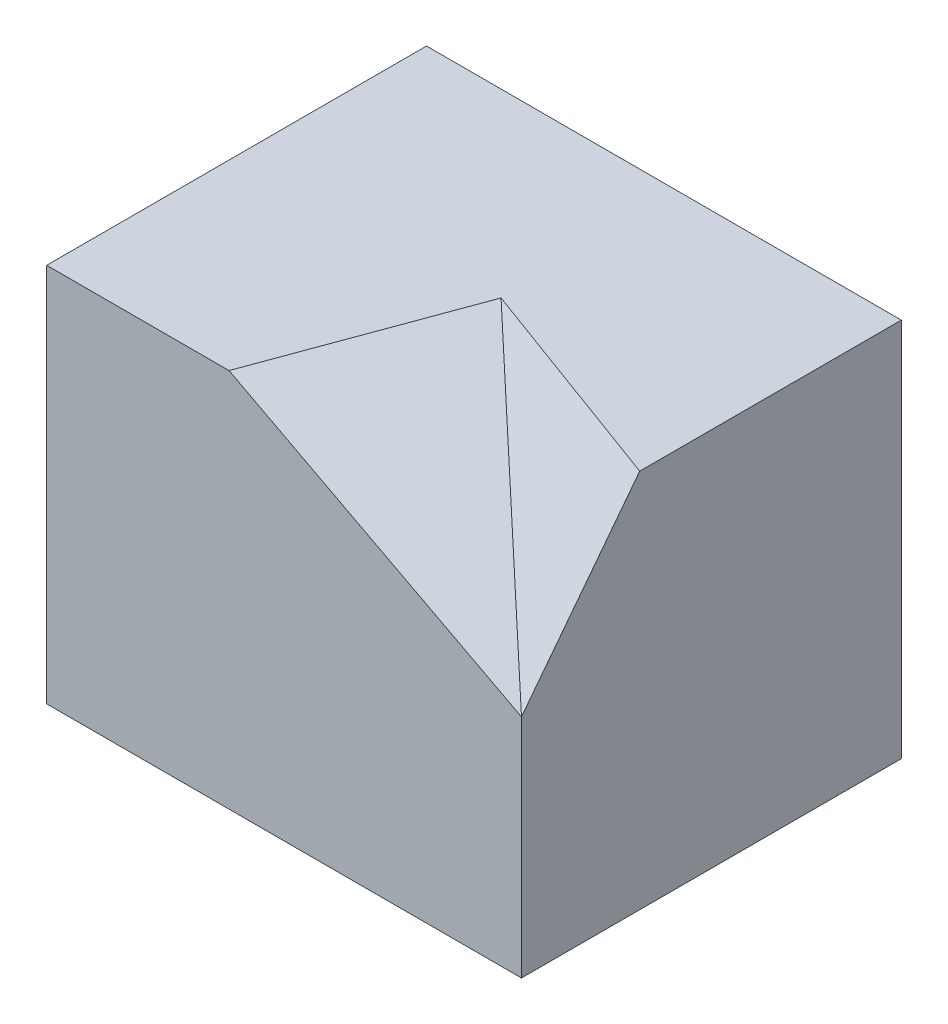
ISO-10303-21;
HEADER;
FILE_DESCRIPTION(('STEP AP214'),'2;1');
FILE_NAME('part.step','',(''),(''),'','','');
FILE_SCHEMA(('AUTOMOTIVE_DESIGN { 1 0 10303 214 1 1 1 1 }'));
ENDSEC;
DATA;
#1=APPLICATION_CONTEXT('core data for automotive mechanical design processes');
#2=APPLICATION_PROTOCOL_DEFINITION('international standard','automotive_design',2000,#1);
#3=PRODUCT_CONTEXT('',#1,'mechanical');
#4=PRODUCT('Part','Part','',(#3));
#5=PRODUCT_RELATED_PRODUCT_CATEGORY('part','',(#4));
#6=PRODUCT_DEFINITION_FORMATION('','',#4);
#7=PRODUCT_DEFINITION_CONTEXT('part definition',#1,'design');
#8=PRODUCT_DEFINITION('design','',#6,#7);
#9=PRODUCT_DEFINITION_SHAPE('','',#8);
#10=(LENGTH_UNIT() NAMED_UNIT(*) SI_UNIT(.MILLI.,.METRE.));
#11=(NAMED_UNIT(*) PLANE_ANGLE_UNIT() SI_UNIT($,.RADIAN.));
#12=(NAMED_UNIT(*) SI_UNIT($,.STERADIAN.) SOLID_ANGLE_UNIT());
#13=UNCERTAINTY_MEASURE_WITH_UNIT(LENGTH_MEASURE(1.E-05),#10,'distance_accuracy_value','');
#14=(GEOMETRIC_REPRESENTATION_CONTEXT(3) GLOBAL_UNCERTAINTY_ASSIGNED_CONTEXT((#13)) GLOBAL_UNIT_ASSIGNED_CONTEXT((#10,
#11,#12)) REPRESENTATION_CONTEXT('',''));
#15=CARTESIAN_POINT('',(0.,0.,0.));
#16=DIRECTION('',(0.,0.,1.));
#17=DIRECTION('',(1.,0.,0.));
#18=AXIS2_PLACEMENT_3D('',#15,#16,#17);
#19=CARTESIAN_POINT('',(0.,1016.,0.));
#20=DIRECTION('',(0.,0.,-1.));
#21=DIRECTION('',(-1.,0.,0.));
#22=AXIS2_PLACEMENT_3D('',#19,#20,#21);
#23=PLANE('',#22);
#24=DIRECTION('',(0.885288524707025,-0.465042178755926,0.));
#25=VECTOR('',#24,1.);
#26=CARTESIAN_POINT('',(487.697722315545,1016.,0.));
#27=LINE('',#26,#25);
#28=CARTESIAN_POINT('',(487.697722315545,1016.,0.));
#29=VERTEX_POINT('',#28);
#30=CARTESIAN_POINT('',(1270.,605.056510384003,0.));
#31=VERTEX_POINT('',#30);
#32=EDGE_CURVE('E105',#29,#31,#27,.T.);
#33=ORIENTED_EDGE('',*,*,#32,.F.);
#34=DIRECTION('',(1.,0.,0.));
#35=VECTOR('',#34,1.);
#36=CARTESIAN_POINT('',(0.,1016.,0.));
#37=LINE('',#36,#35);
#38=CARTESIAN_POINT('',(0.,1016.,0.));
#39=VERTEX_POINT('',#38);
#40=EDGE_CURVE('E92',#39,#29,#37,.T.);
#41=ORIENTED_EDGE('',*,*,#40,.F.);
#42=DIRECTION('',(0.,-1.,0.));
#43=VECTOR('',#42,1.);
#44=CARTESIAN_POINT('',(0.,1016.,0.));
#45=LINE('',#44,#43);
#46=CARTESIAN_POINT('',(0.,0.,0.));
#47=VERTEX_POINT('',#46);
#48=EDGE_CURVE('E12',#39,#47,#45,.T.);
#49=ORIENTED_EDGE('',*,*,#48,.T.);
#50=DIRECTION('',(1.,0.,0.));
#51=VECTOR('',#50,1.);
#52=CARTESIAN_POINT('',(0.,0.,0.));
#53=LINE('',#52,#51);
#54=CARTESIAN_POINT('',(1270.,0.,0.));
#55=VERTEX_POINT('',#54);
#56=EDGE_CURVE('E133',#47,#55,#53,.T.);
#57=ORIENTED_EDGE('',*,*,#56,.T.);
#58=DIRECTION('',(0.,-1.,0.));
#59=VECTOR('',#58,1.);
#60=CARTESIAN_POINT('',(1270.,1016.,0.));
#61=LINE('',#60,#59);
#62=EDGE_CURVE('E49',#31,#55,#61,.T.);
#63=ORIENTED_EDGE('',*,*,#62,.F.);
#64=EDGE_LOOP('',(#33,#41,#49,#57,#63));
#65=FACE_BOUND('',#64,.T.);
#66=ADVANCED_FACE('F39',(#65),#23,.F.);
#67=CARTESIAN_POINT('',(0.,1016.,0.));
#68=DIRECTION('',(0.,-1.,0.));
#69=DIRECTION('',(0.,0.,-1.));
#70=AXIS2_PLACEMENT_3D('',#67,#68,#69);
#71=PLANE('',#70);
#72=DIRECTION('',(-0.938549534107963,0.,-0.345144566849496));
#73=VECTOR('',#72,1.);
#74=CARTESIAN_POINT('',(683.341932375015,1016.,-532.014117673498));
#75=LINE('',#74,#73);
#76=CARTESIAN_POINT('',(1270.,1016.,-316.275003987149));
#77=VERTEX_POINT('',#76);
#78=CARTESIAN_POINT('',(683.341932375015,1016.,-532.014117673498));
#79=VERTEX_POINT('',#78);
#80=EDGE_CURVE('E43',#77,#79,#75,.T.);
#81=ORIENTED_EDGE('',*,*,#80,.F.);
#82=DIRECTION('',(0.,0.,-1.));
#83=VECTOR('',#82,1.);
#84=CARTESIAN_POINT('',(1270.,1016.,0.));
#85=LINE('',#84,#83);
#86=CARTESIAN_POINT('',(1270.,1016.,-1016.));
#87=VERTEX_POINT('',#86);
#88=EDGE_CURVE('E119',#77,#87,#85,.T.);
#89=ORIENTED_EDGE('',*,*,#88,.T.);
#90=DIRECTION('',(-1.,0.,0.));
#91=VECTOR('',#90,1.);
#92=CARTESIAN_POINT('',(0.,1016.,-1016.));
#93=LINE('',#92,#91);
#94=CARTESIAN_POINT('',(0.,1016.,-1016.));
#95=VERTEX_POINT('',#94);
#96=EDGE_CURVE('E66',#87,#95,#93,.T.);
#97=ORIENTED_EDGE('',*,*,#96,.T.);
#98=DIRECTION('',(0.,0.,1.));
#99=VECTOR('',#98,1.);
#100=CARTESIAN_POINT('',(0.,1016.,0.));
#101=LINE('',#100,#99);
#102=EDGE_CURVE('E117',#95,#39,#101,.T.);
#103=ORIENTED_EDGE('',*,*,#102,.T.);
#104=ORIENTED_EDGE('',*,*,#40,.T.);
#105=DIRECTION('',(-0.345144566849496,0.,0.938549534107963));
#106=VECTOR('',#105,1.);
#107=CARTESIAN_POINT('',(487.697722315545,1016.,0.));
#108=LINE('',#107,#106);
#109=EDGE_CURVE('E102',#79,#29,#108,.T.);
#110=ORIENTED_EDGE('',*,*,#109,.F.);
#111=EDGE_LOOP('',(#81,#89,#97,#103,#104,#110));
#112=FACE_BOUND('',#111,.T.);
#113=ADVANCED_FACE('F115',(#112),#71,.F.);
#114=CARTESIAN_POINT('',(0.,1016.,0.));
#115=DIRECTION('',(1.,0.,0.));
#116=DIRECTION('',(0.,0.,-1.));
#117=AXIS2_PLACEMENT_3D('',#114,#115,#116);
#118=PLANE('',#117);
#119=DIRECTION('',(0.,0.,1.));
#120=VECTOR('',#119,1.);
#121=CARTESIAN_POINT('',(0.,0.,0.));
#122=LINE('',#121,#120);
#123=CARTESIAN_POINT('',(0.,0.,-1016.));
#124=VERTEX_POINT('',#123);
#125=EDGE_CURVE('E113',#124,#47,#122,.T.);
#126=ORIENTED_EDGE('',*,*,#125,.T.);
#127=ORIENTED_EDGE('',*,*,#48,.F.);
#128=ORIENTED_EDGE('',*,*,#102,.F.);
#129=DIRECTION('',(0.,-1.,0.));
#130=VECTOR('',#129,1.);
#131=CARTESIAN_POINT('',(0.,1016.,-1016.));
#132=LINE('',#131,#130);
#133=EDGE_CURVE('E130',#95,#124,#132,.T.);
#134=ORIENTED_EDGE('',*,*,#133,.T.);
#135=EDGE_LOOP('',(#126,#127,#128,#134));
#136=FACE_BOUND('',#135,.T.);
#137=ADVANCED_FACE('F41',(#136),#118,.F.);
#138=CARTESIAN_POINT('',(1270.,1016.,0.));
#139=DIRECTION('',(-1.,0.,0.));
#140=DIRECTION('',(0.,0.,1.));
#141=AXIS2_PLACEMENT_3D('',#138,#139,#140);
#142=PLANE('',#141);
#143=ORIENTED_EDGE('',*,*,#88,.F.);
#144=DIRECTION('',(0.,-0.792470539725738,0.609910193116));
#145=VECTOR('',#144,1.);
#146=CARTESIAN_POINT('',(1270.,1016.,-316.275003987149));
#147=LINE('',#146,#145);
#148=EDGE_CURVE('E109',#77,#31,#147,.T.);
#149=ORIENTED_EDGE('',*,*,#148,.T.);
#150=ORIENTED_EDGE('',*,*,#62,.T.);
#151=DIRECTION('',(0.,0.,-1.));
#152=VECTOR('',#151,1.);
#153=CARTESIAN_POINT('',(1270.,0.,0.));
#154=LINE('',#153,#152);
#155=CARTESIAN_POINT('',(1270.,0.,-1016.));
#156=VERTEX_POINT('',#155);
#157=EDGE_CURVE('E135',#55,#156,#154,.T.);
#158=ORIENTED_EDGE('',*,*,#157,.T.);
#159=DIRECTION('',(0.,-1.,0.));
#160=VECTOR('',#159,1.);
#161=CARTESIAN_POINT('',(1270.,1016.,-1016.));
#162=LINE('',#161,#160);
#163=EDGE_CURVE('E139',#87,#156,#162,.T.);
#164=ORIENTED_EDGE('',*,*,#163,.F.);
#165=EDGE_LOOP('',(#143,#149,#150,#158,#164));
#166=FACE_BOUND('',#165,.T.);
#167=ADVANCED_FACE('F187',(#166),#142,.F.);
#168=CARTESIAN_POINT('',(0.,1016.,-1016.));
#169=DIRECTION('',(0.,0.,1.));
#170=DIRECTION('',(1.,0.,0.));
#171=AXIS2_PLACEMENT_3D('',#168,#169,#170);
#172=PLANE('',#171);
#173=DIRECTION('',(-1.,0.,0.));
#174=VECTOR('',#173,1.);
#175=CARTESIAN_POINT('',(0.,0.,-1016.));
#176=LINE('',#175,#174);
#177=EDGE_CURVE('E86',#156,#124,#176,.T.);
#178=ORIENTED_EDGE('',*,*,#177,.T.);
#179=ORIENTED_EDGE('',*,*,#133,.F.);
#180=ORIENTED_EDGE('',*,*,#96,.F.);
#181=ORIENTED_EDGE('',*,*,#163,.T.);
#182=EDGE_LOOP('',(#178,#179,#180,#181));
#183=FACE_BOUND('',#182,.T.);
#184=ADVANCED_FACE('F189',(#183),#172,.F.);
#185=CARTESIAN_POINT('',(0.,0.,0.));
#186=DIRECTION('',(0.,-1.,0.));
#187=DIRECTION('',(0.,0.,-1.));
#188=AXIS2_PLACEMENT_3D('',#185,#186,#187);
#189=PLANE('',#188);
#190=ORIENTED_EDGE('',*,*,#125,.F.);
#191=ORIENTED_EDGE('',*,*,#177,.F.);
#192=ORIENTED_EDGE('',*,*,#157,.F.);
#193=ORIENTED_EDGE('',*,*,#56,.F.);
#194=EDGE_LOOP('',(#190,#191,#192,#193));
#195=FACE_BOUND('',#194,.T.);
#196=ADVANCED_FACE('F167',(#195),#189,.T.);
#197=CARTESIAN_POINT('',(0.290035834611058,-0.607002642724071,-0.788692691684537));
#198=DIRECTION('',(0.279786265268888,-0.585551791018717,-0.760821099734793));
#199=DIRECTION('',(0.,0.792470539725738,-0.609910193116));
#200=AXIS2_PLACEMENT_3D('',#197,#198,#199);
#201=PLANE('',#200);
#202=ORIENTED_EDGE('',*,*,#148,.F.);
#203=ORIENTED_EDGE('',*,*,#80,.T.);
#204=DIRECTION('',(0.657516032245867,-0.460578227217536,0.596272055317707));
#205=VECTOR('',#204,1.);
#206=CARTESIAN_POINT('',(683.341932375015,1016.,-532.014117673498));
#207=LINE('',#206,#205);
#208=EDGE_CURVE('E107',#79,#31,#207,.T.);
#209=ORIENTED_EDGE('',*,*,#208,.T.);
#210=EDGE_LOOP('',(#202,#203,#209));
#211=FACE_BOUND('',#210,.T.);
#212=ADVANCED_FACE('F158',(#211),#201,.F.);
#213=CARTESIAN_POINT('',(508.872531633113,968.727210935093,187.134064990025));
#214=DIRECTION('',(-0.4583873952817,-0.872619989005806,-0.168568533939064));
#215=DIRECTION('',(0.885288524707025,-0.465042178755926,0.));
#216=AXIS2_PLACEMENT_3D('',#213,#214,#215);
#217=PLANE('',#216);
#218=ORIENTED_EDGE('',*,*,#208,.F.);
#219=ORIENTED_EDGE('',*,*,#109,.T.);
#220=ORIENTED_EDGE('',*,*,#32,.T.);
#221=EDGE_LOOP('',(#218,#219,#220));
#222=FACE_BOUND('',#221,.T.);
#223=ADVANCED_FACE('F104',(#222),#217,.F.);
#224=CLOSED_SHELL('',(#66,#113,#137,#167,#184,#196,#212,#223));
#225=MANIFOLD_SOLID_BREP('B2',#224);
#226=ADVANCED_BREP_SHAPE_REPRESENTATION('',(#18,#225),#14);
#227=SHAPE_DEFINITION_REPRESENTATION(#9,#226);
ENDSEC;
END-ISO-10303-21;
